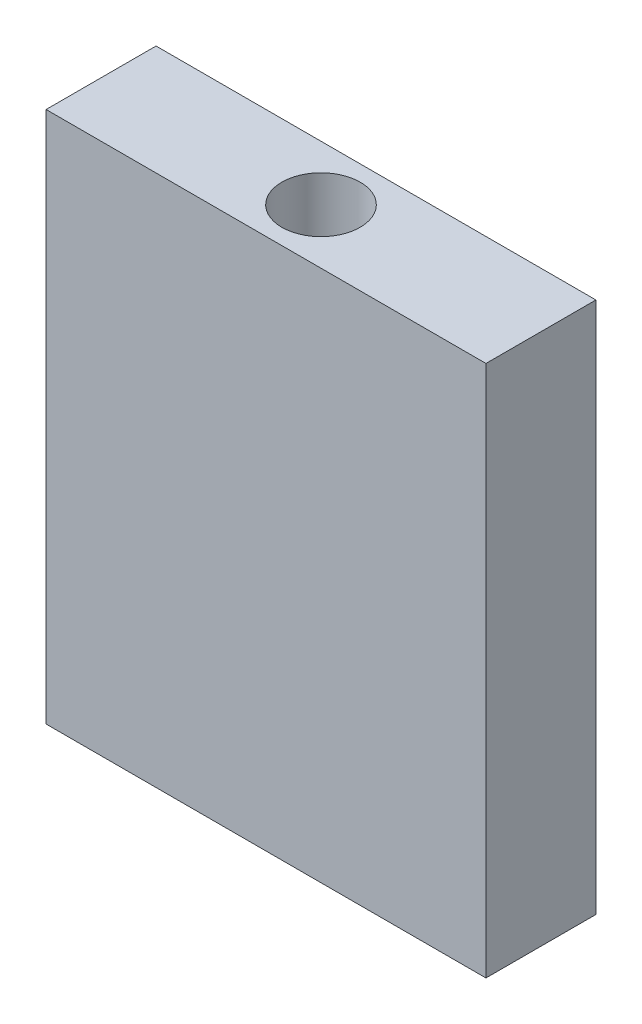
ISO-10303-21;
HEADER;
FILE_DESCRIPTION(('STEP AP214'),'2;1');
FILE_NAME('part.step','',(''),(''),'','','');
FILE_SCHEMA(('AUTOMOTIVE_DESIGN { 1 0 10303 214 1 1 1 1 }'));
ENDSEC;
DATA;
#1=APPLICATION_CONTEXT('core data for automotive mechanical design processes');
#2=APPLICATION_PROTOCOL_DEFINITION('international standard','automotive_design',2000,#1);
#3=PRODUCT_CONTEXT('',#1,'mechanical');
#4=PRODUCT('Part','Part','',(#3));
#5=PRODUCT_RELATED_PRODUCT_CATEGORY('part','',(#4));
#6=PRODUCT_DEFINITION_FORMATION('','',#4);
#7=PRODUCT_DEFINITION_CONTEXT('part definition',#1,'design');
#8=PRODUCT_DEFINITION('design','',#6,#7);
#9=PRODUCT_DEFINITION_SHAPE('','',#8);
#10=(LENGTH_UNIT() NAMED_UNIT(*) SI_UNIT(.MILLI.,.METRE.));
#11=(NAMED_UNIT(*) PLANE_ANGLE_UNIT() SI_UNIT($,.RADIAN.));
#12=(NAMED_UNIT(*) SI_UNIT($,.STERADIAN.) SOLID_ANGLE_UNIT());
#13=UNCERTAINTY_MEASURE_WITH_UNIT(LENGTH_MEASURE(1.E-05),#10,'distance_accuracy_value','');
#14=(GEOMETRIC_REPRESENTATION_CONTEXT(3) GLOBAL_UNCERTAINTY_ASSIGNED_CONTEXT((#13)) GLOBAL_UNIT_ASSIGNED_CONTEXT((#10,
#11,#12)) REPRESENTATION_CONTEXT('',''));
#15=CARTESIAN_POINT('',(0.,0.,0.));
#16=DIRECTION('',(0.,0.,1.));
#17=DIRECTION('',(1.,0.,0.));
#18=AXIS2_PLACEMENT_3D('',#15,#16,#17);
#19=CARTESIAN_POINT('',(0.,0.,12.5));
#20=DIRECTION('',(1.,0.,0.));
#21=DIRECTION('',(0.,1.,0.));
#22=AXIS2_PLACEMENT_3D('',#19,#20,#21);
#23=PLANE('',#22);
#24=DIRECTION('',(0.,-1.,0.));
#25=VECTOR('',#24,1.);
#26=CARTESIAN_POINT('',(0.,0.,0.));
#27=LINE('',#26,#25);
#28=CARTESIAN_POINT('',(0.,60.5,0.));
#29=VERTEX_POINT('',#28);
#30=CARTESIAN_POINT('',(0.,0.,0.));
#31=VERTEX_POINT('',#30);
#32=EDGE_CURVE('E107',#29,#31,#27,.T.);
#33=ORIENTED_EDGE('',*,*,#32,.T.);
#34=DIRECTION('',(0.,0.,-1.));
#35=VECTOR('',#34,1.);
#36=CARTESIAN_POINT('',(0.,0.,12.5));
#37=LINE('',#36,#35);
#38=CARTESIAN_POINT('',(0.,0.,12.5));
#39=VERTEX_POINT('',#38);
#40=EDGE_CURVE('E11',#39,#31,#37,.T.);
#41=ORIENTED_EDGE('',*,*,#40,.F.);
#42=DIRECTION('',(0.,-1.,0.));
#43=VECTOR('',#42,1.);
#44=CARTESIAN_POINT('',(0.,0.,12.5));
#45=LINE('',#44,#43);
#46=CARTESIAN_POINT('',(0.,60.5,12.5));
#47=VERTEX_POINT('',#46);
#48=EDGE_CURVE('E91',#47,#39,#45,.T.);
#49=ORIENTED_EDGE('',*,*,#48,.F.);
#50=DIRECTION('',(0.,0.,-1.));
#51=VECTOR('',#50,1.);
#52=CARTESIAN_POINT('',(0.,60.5,12.5));
#53=LINE('',#52,#51);
#54=EDGE_CURVE('E103',#47,#29,#53,.T.);
#55=ORIENTED_EDGE('',*,*,#54,.T.);
#56=EDGE_LOOP('',(#33,#41,#49,#55));
#57=FACE_BOUND('',#56,.T.);
#58=ADVANCED_FACE('F39',(#57),#23,.F.);
#59=CARTESIAN_POINT('',(0.,0.,12.5));
#60=DIRECTION('',(0.,1.,0.));
#61=DIRECTION('',(0.,0.,1.));
#62=AXIS2_PLACEMENT_3D('',#59,#60,#61);
#63=PLANE('',#62);
#64=DIRECTION('',(1.,0.,0.));
#65=VECTOR('',#64,1.);
#66=CARTESIAN_POINT('',(0.,0.,0.));
#67=LINE('',#66,#65);
#68=CARTESIAN_POINT('',(50.,0.,0.));
#69=VERTEX_POINT('',#68);
#70=EDGE_CURVE('E96',#31,#69,#67,.T.);
#71=ORIENTED_EDGE('',*,*,#70,.T.);
#72=DIRECTION('',(0.,0.,-1.));
#73=VECTOR('',#72,1.);
#74=CARTESIAN_POINT('',(50.,0.,12.5));
#75=LINE('',#74,#73);
#76=CARTESIAN_POINT('',(50.,0.,12.5));
#77=VERTEX_POINT('',#76);
#78=EDGE_CURVE('E48',#77,#69,#75,.T.);
#79=ORIENTED_EDGE('',*,*,#78,.F.);
#80=DIRECTION('',(1.,0.,0.));
#81=VECTOR('',#80,1.);
#82=CARTESIAN_POINT('',(0.,0.,12.5));
#83=LINE('',#82,#81);
#84=EDGE_CURVE('E86',#39,#77,#83,.T.);
#85=ORIENTED_EDGE('',*,*,#84,.F.);
#86=ORIENTED_EDGE('',*,*,#40,.T.);
#87=EDGE_LOOP('',(#71,#79,#85,#86));
#88=FACE_BOUND('',#87,.T.);
#89=ADVANCED_FACE('F95',(#88),#63,.F.);
#90=CARTESIAN_POINT('',(50.,0.,12.5));
#91=DIRECTION('',(-1.,0.,0.));
#92=DIRECTION('',(0.,-1.,0.));
#93=AXIS2_PLACEMENT_3D('',#90,#91,#92);
#94=PLANE('',#93);
#95=DIRECTION('',(0.,1.,0.));
#96=VECTOR('',#95,1.);
#97=CARTESIAN_POINT('',(50.,0.,0.));
#98=LINE('',#97,#96);
#99=CARTESIAN_POINT('',(50.,60.5,0.));
#100=VERTEX_POINT('',#99);
#101=EDGE_CURVE('E73',#69,#100,#98,.T.);
#102=ORIENTED_EDGE('',*,*,#101,.T.);
#103=DIRECTION('',(0.,0.,-1.));
#104=VECTOR('',#103,1.);
#105=CARTESIAN_POINT('',(50.,60.5,12.5));
#106=LINE('',#105,#104);
#107=CARTESIAN_POINT('',(50.,60.5,12.5));
#108=VERTEX_POINT('',#107);
#109=EDGE_CURVE('E98',#108,#100,#106,.T.);
#110=ORIENTED_EDGE('',*,*,#109,.F.);
#111=DIRECTION('',(0.,1.,0.));
#112=VECTOR('',#111,1.);
#113=CARTESIAN_POINT('',(50.,0.,12.5));
#114=LINE('',#113,#112);
#115=EDGE_CURVE('E89',#77,#108,#114,.T.);
#116=ORIENTED_EDGE('',*,*,#115,.F.);
#117=ORIENTED_EDGE('',*,*,#78,.T.);
#118=EDGE_LOOP('',(#102,#110,#116,#117));
#119=FACE_BOUND('',#118,.T.);
#120=ADVANCED_FACE('F99',(#119),#94,.F.);
#121=CARTESIAN_POINT('',(0.,60.5,12.5));
#122=DIRECTION('',(0.,-1.,0.));
#123=DIRECTION('',(0.,0.,-1.));
#124=AXIS2_PLACEMENT_3D('',#121,#122,#123);
#125=PLANE('',#124);
#126=CARTESIAN_POINT('',(25.,60.5,6.25));
#127=DIRECTION('',(0.,1.,0.));
#128=DIRECTION('',(0.,0.,1.));
#129=AXIS2_PLACEMENT_3D('',#126,#127,#128);
#130=CIRCLE('',#129,4.45);
#131=CARTESIAN_POINT('',(25.,60.5,10.7));
#132=VERTEX_POINT('',#131);
#133=EDGE_CURVE('E128',#132,#132,#130,.T.);
#134=ORIENTED_EDGE('',*,*,#133,.F.);
#135=EDGE_LOOP('',(#134));
#136=FACE_BOUND('',#135,.T.);
#137=DIRECTION('',(-1.,0.,0.));
#138=VECTOR('',#137,1.);
#139=CARTESIAN_POINT('',(0.,60.5,0.));
#140=LINE('',#139,#138);
#141=EDGE_CURVE('E79',#100,#29,#140,.T.);
#142=ORIENTED_EDGE('',*,*,#141,.T.);
#143=ORIENTED_EDGE('',*,*,#54,.F.);
#144=DIRECTION('',(-1.,0.,0.));
#145=VECTOR('',#144,1.);
#146=CARTESIAN_POINT('',(0.,60.5,12.5));
#147=LINE('',#146,#145);
#148=EDGE_CURVE('E56',#108,#47,#147,.T.);
#149=ORIENTED_EDGE('',*,*,#148,.F.);
#150=ORIENTED_EDGE('',*,*,#109,.T.);
#151=EDGE_LOOP('',(#142,#143,#149,#150));
#152=FACE_BOUND('',#151,.T.);
#153=ADVANCED_FACE('F121',(#136,#152),#125,.F.);
#154=CARTESIAN_POINT('',(0.,0.,12.5));
#155=DIRECTION('',(0.,0.,-1.));
#156=DIRECTION('',(-1.,0.,0.));
#157=AXIS2_PLACEMENT_3D('',#154,#155,#156);
#158=PLANE('',#157);
#159=ORIENTED_EDGE('',*,*,#48,.T.);
#160=ORIENTED_EDGE('',*,*,#84,.T.);
#161=ORIENTED_EDGE('',*,*,#115,.T.);
#162=ORIENTED_EDGE('',*,*,#148,.T.);
#163=EDGE_LOOP('',(#159,#160,#161,#162));
#164=FACE_BOUND('',#163,.T.);
#165=ADVANCED_FACE('F87',(#164),#158,.F.);
#166=CARTESIAN_POINT('',(0.,0.,0.));
#167=DIRECTION('',(0.,0.,-1.));
#168=DIRECTION('',(-1.,0.,0.));
#169=AXIS2_PLACEMENT_3D('',#166,#167,#168);
#170=PLANE('',#169);
#171=ORIENTED_EDGE('',*,*,#32,.F.);
#172=ORIENTED_EDGE('',*,*,#141,.F.);
#173=ORIENTED_EDGE('',*,*,#101,.F.);
#174=ORIENTED_EDGE('',*,*,#70,.F.);
#175=EDGE_LOOP('',(#171,#172,#173,#174));
#176=FACE_BOUND('',#175,.T.);
#177=ADVANCED_FACE('F124',(#176),#170,.T.);
#178=CARTESIAN_POINT('',(25.,48.,6.25));
#179=DIRECTION('',(0.,1.,0.));
#180=DIRECTION('',(0.,0.,1.));
#181=AXIS2_PLACEMENT_3D('',#178,#179,#180);
#182=CYLINDRICAL_SURFACE('',#181,4.45);
#183=CARTESIAN_POINT('',(25.,48.,6.25));
#184=DIRECTION('',(0.,1.,0.));
#185=DIRECTION('',(0.,0.,1.));
#186=AXIS2_PLACEMENT_3D('',#183,#184,#185);
#187=CIRCLE('',#186,4.45);
#188=CARTESIAN_POINT('',(25.,48.,10.7));
#189=VERTEX_POINT('',#188);
#190=EDGE_CURVE('E111',#189,#189,#187,.T.);
#191=ORIENTED_EDGE('',*,*,#190,.F.);
#192=EDGE_LOOP('',(#191));
#193=FACE_BOUND('',#192,.T.);
#194=ORIENTED_EDGE('',*,*,#133,.T.);
#195=EDGE_LOOP('',(#194));
#196=FACE_BOUND('',#195,.T.);
#197=ADVANCED_FACE('F138',(#193,#196),#182,.F.);
#198=CARTESIAN_POINT('',(25.,48.,6.25));
#199=DIRECTION('',(0.,1.,0.));
#200=DIRECTION('',(0.,0.,1.));
#201=AXIS2_PLACEMENT_3D('',#198,#199,#200);
#202=PLANE('',#201);
#203=ORIENTED_EDGE('',*,*,#190,.T.);
#204=EDGE_LOOP('',(#203));
#205=FACE_BOUND('',#204,.T.);
#206=ADVANCED_FACE('F136',(#205),#202,.T.);
#207=CLOSED_SHELL('',(#58,#89,#120,#153,#165,#177,#197,#206));
#208=MANIFOLD_SOLID_BREP('B2',#207);
#209=ADVANCED_BREP_SHAPE_REPRESENTATION('',(#18,#208),#14);
#210=SHAPE_DEFINITION_REPRESENTATION(#9,#209);
ENDSEC;
END-ISO-10303-21;
